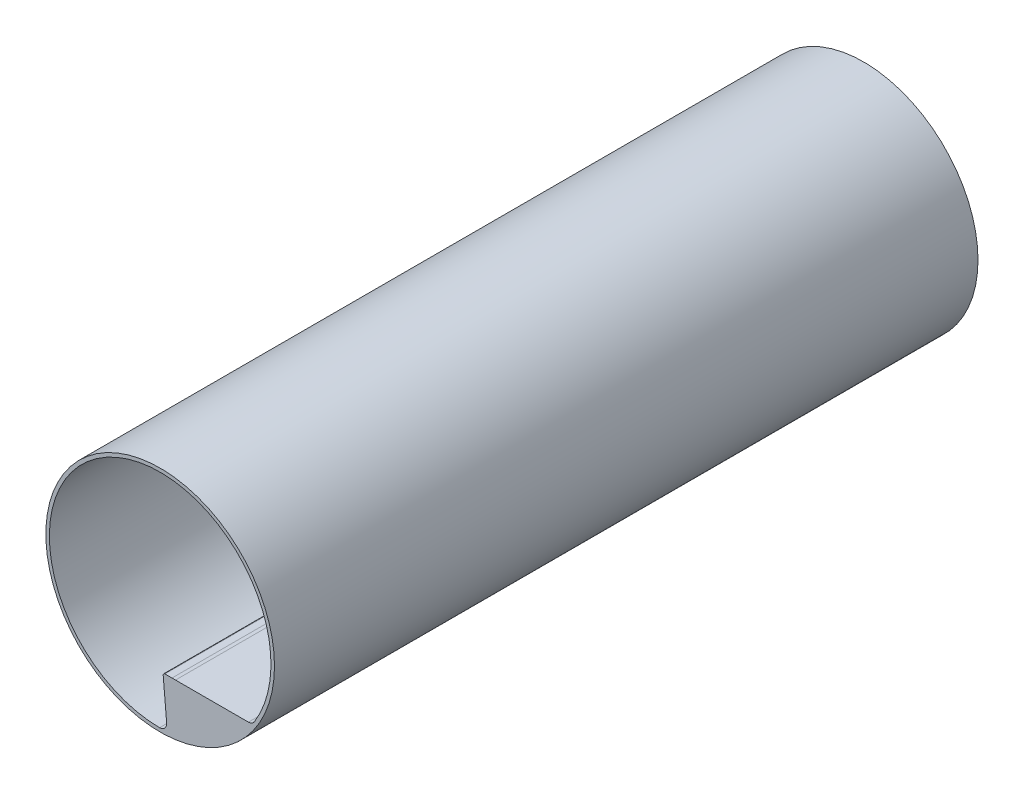
ISO-10303-21;
HEADER;
FILE_DESCRIPTION(('STEP AP214'),'2;1');
FILE_NAME('part.step','',(''),(''),'','','');
FILE_SCHEMA(('AUTOMOTIVE_DESIGN { 1 0 10303 214 1 1 1 1 }'));
ENDSEC;
DATA;
#1=APPLICATION_CONTEXT('core data for automotive mechanical design processes');
#2=APPLICATION_PROTOCOL_DEFINITION('international standard','automotive_design',2000,#1);
#3=PRODUCT_CONTEXT('',#1,'mechanical');
#4=PRODUCT('Part','Part','',(#3));
#5=PRODUCT_RELATED_PRODUCT_CATEGORY('part','',(#4));
#6=PRODUCT_DEFINITION_FORMATION('','',#4);
#7=PRODUCT_DEFINITION_CONTEXT('part definition',#1,'design');
#8=PRODUCT_DEFINITION('design','',#6,#7);
#9=PRODUCT_DEFINITION_SHAPE('','',#8);
#10=(LENGTH_UNIT() NAMED_UNIT(*) SI_UNIT(.MILLI.,.METRE.));
#11=(NAMED_UNIT(*) PLANE_ANGLE_UNIT() SI_UNIT($,.RADIAN.));
#12=(NAMED_UNIT(*) SI_UNIT($,.STERADIAN.) SOLID_ANGLE_UNIT());
#13=UNCERTAINTY_MEASURE_WITH_UNIT(LENGTH_MEASURE(1.E-05),#10,'distance_accuracy_value','');
#14=(GEOMETRIC_REPRESENTATION_CONTEXT(3) GLOBAL_UNCERTAINTY_ASSIGNED_CONTEXT((#13)) GLOBAL_UNIT_ASSIGNED_CONTEXT((#10,
#11,#12)) REPRESENTATION_CONTEXT('',''));
#15=CARTESIAN_POINT('',(0.,0.,0.));
#16=DIRECTION('',(0.,0.,1.));
#17=DIRECTION('',(1.,0.,0.));
#18=AXIS2_PLACEMENT_3D('',#15,#16,#17);
#19=CARTESIAN_POINT('',(80.8398292582413,-1750.,20000.));
#20=DIRECTION('',(0.,1.,0.));
#21=DIRECTION('',(0.,0.,1.));
#22=AXIS2_PLACEMENT_3D('',#19,#20,#21);
#23=PLANE('',#22);
#24=DIRECTION('',(1.,0.,0.));
#25=VECTOR('',#24,1.);
#26=CARTESIAN_POINT('',(80.8398292582413,-1750.,0.));
#27=LINE('',#26,#25);
#28=CARTESIAN_POINT('',(436.724186643337,-1750.,0.));
#29=VERTEX_POINT('',#28);
#30=CARTESIAN_POINT('',(2509.98007960223,-1750.,0.));
#31=VERTEX_POINT('',#30);
#32=EDGE_CURVE('E107',#29,#31,#27,.T.);
#33=ORIENTED_EDGE('',*,*,#32,.F.);
#34=DIRECTION('',(0.,0.,1.));
#35=VECTOR('',#34,1.);
#36=CARTESIAN_POINT('',(436.724186643337,-1750.,20000.));
#37=LINE('',#36,#35);
#38=CARTESIAN_POINT('',(436.724186643337,-1750.,20000.));
#39=VERTEX_POINT('',#38);
#40=EDGE_CURVE('E11',#29,#39,#37,.T.);
#41=ORIENTED_EDGE('',*,*,#40,.T.);
#42=DIRECTION('',(1.,0.,0.));
#43=VECTOR('',#42,1.);
#44=CARTESIAN_POINT('',(80.8398292582413,-1750.,20000.));
#45=LINE('',#44,#43);
#46=CARTESIAN_POINT('',(2509.98007960223,-1750.,20000.));
#47=VERTEX_POINT('',#46);
#48=EDGE_CURVE('E175',#39,#47,#45,.T.);
#49=ORIENTED_EDGE('',*,*,#48,.T.);
#50=DIRECTION('',(0.,0.,1.));
#51=VECTOR('',#50,1.);
#52=CARTESIAN_POINT('',(2509.98007960223,-1750.,0.));
#53=LINE('',#52,#51);
#54=EDGE_CURVE('E138',#47,#31,#53,.F.);
#55=ORIENTED_EDGE('',*,*,#54,.T.);
#56=EDGE_LOOP('',(#33,#41,#49,#55));
#57=FACE_BOUND('',#56,.T.);
#58=ADVANCED_FACE('F37',(#57),#23,.T.);
#59=CARTESIAN_POINT('',(135.405254311705,-1750.,20000.));
#60=VERTEX_POINT('',#59);
#61=CARTESIAN_POINT('',(336.724186643337,-1750.,20000.));
#62=VERTEX_POINT('',#61);
#63=EDGE_CURVE('E163',#60,#62,#45,.T.);
#64=ORIENTED_EDGE('',*,*,#63,.T.);
#65=DIRECTION('',(0.,0.,-1.));
#66=VECTOR('',#65,1.);
#67=CARTESIAN_POINT('',(336.724186643337,-1750.,20000.));
#68=LINE('',#67,#66);
#69=CARTESIAN_POINT('',(336.724186643337,-1750.,0.));
#70=VERTEX_POINT('',#69);
#71=EDGE_CURVE('E46',#62,#70,#68,.T.);
#72=ORIENTED_EDGE('',*,*,#71,.T.);
#73=CARTESIAN_POINT('',(135.405254311705,-1750.,0.));
#74=VERTEX_POINT('',#73);
#75=EDGE_CURVE('E160',#74,#70,#27,.T.);
#76=ORIENTED_EDGE('',*,*,#75,.F.);
#77=DIRECTION('',(0.,0.,-1.));
#78=VECTOR('',#77,1.);
#79=CARTESIAN_POINT('',(135.405254311705,-1750.,20000.));
#80=LINE('',#79,#78);
#81=EDGE_CURVE('E149',#74,#60,#80,.F.);
#82=ORIENTED_EDGE('',*,*,#81,.T.);
#83=EDGE_LOOP('',(#64,#72,#76,#82));
#84=FACE_BOUND('',#83,.T.);
#85=ADVANCED_FACE('F158',(#84),#23,.T.);
#86=CARTESIAN_POINT('',(0.,0.,20000.));
#87=DIRECTION('',(0.,0.,1.));
#88=DIRECTION('',(1.,0.,0.));
#89=AXIS2_PLACEMENT_3D('',#86,#87,#88);
#90=PLANE('',#89);
#91=CARTESIAN_POINT('',(0.,0.,20000.));
#92=DIRECTION('',(0.,0.,1.));
#93=DIRECTION('',(1.,0.,0.));
#94=AXIS2_PLACEMENT_3D('',#91,#92,#93);
#95=CIRCLE('',#94,3250.);
#96=CARTESIAN_POINT('',(3250.,0.,20000.));
#97=VERTEX_POINT('',#96);
#98=EDGE_CURVE('E128',#97,#97,#95,.T.);
#99=ORIENTED_EDGE('',*,*,#98,.T.);
#100=EDGE_LOOP('',(#99));
#101=FACE_BOUND('',#100,.T.);
#102=ORIENTED_EDGE('',*,*,#63,.F.);
#103=CARTESIAN_POINT('',(135.405254311705,-1800.,20000.));
#104=DIRECTION('',(0.,0.,1.));
#105=DIRECTION('',(1.,0.,0.));
#106=AXIS2_PLACEMENT_3D('',#103,#104,#105);
#107=CIRCLE('',#106,50.);
#108=CARTESIAN_POINT('',(85.5955194071174,-1804.35778713738,20000.));
#109=VERTEX_POINT('',#108);
#110=EDGE_CURVE('E151',#60,#109,#107,.T.);
#111=ORIENTED_EDGE('',*,*,#110,.T.);
#112=DIRECTION('',(-0.0871557427476551,0.996194698091746,0.));
#113=VECTOR('',#112,1.);
#114=CARTESIAN_POINT('',(80.8398292582413,-1750.,20000.));
#115=LINE('',#114,#113);
#116=CARTESIAN_POINT('',(184.297887317519,-2932.53101475971,20000.));
#117=VERTEX_POINT('',#116);
#118=EDGE_CURVE('E168',#117,#109,#115,.T.);
#119=ORIENTED_EDGE('',*,*,#118,.F.);
#120=CARTESIAN_POINT('',(-14.9410523008298,-2949.96216330924,20000.));
#121=DIRECTION('',(0.,0.,1.));
#122=DIRECTION('',(1.,0.,0.));
#123=AXIS2_PLACEMENT_3D('',#120,#121,#122);
#124=CIRCLE('',#123,200.);
#125=CARTESIAN_POINT('',(-15.9540049991912,-3149.95959810987,20000.));
#126=VERTEX_POINT('',#125);
#127=EDGE_CURVE('E113',#117,#126,#124,.F.);
#128=ORIENTED_EDGE('',*,*,#127,.T.);
#129=CARTESIAN_POINT('',(0.,0.,20000.));
#130=DIRECTION('',(0.,0.,1.));
#131=DIRECTION('',(1.,0.,0.));
#132=AXIS2_PLACEMENT_3D('',#129,#130,#131);
#133=CIRCLE('',#132,3150.);
#134=CARTESIAN_POINT('',(2680.14822059221,-1655.08474576271,20000.));
#135=VERTEX_POINT('',#134);
#136=EDGE_CURVE('E167',#135,#126,#133,.T.);
#137=ORIENTED_EDGE('',*,*,#136,.F.);
#138=CARTESIAN_POINT('',(2509.98007960223,-1550.,20000.));
#139=DIRECTION('',(0.,0.,1.));
#140=DIRECTION('',(1.,0.,0.));
#141=AXIS2_PLACEMENT_3D('',#138,#139,#140);
#142=CIRCLE('',#141,200.);
#143=EDGE_CURVE('E112',#135,#47,#142,.F.);
#144=ORIENTED_EDGE('',*,*,#143,.T.);
#145=ORIENTED_EDGE('',*,*,#48,.F.);
#146=EDGE_CURVE('E174',#62,#39,#45,.T.);
#147=ORIENTED_EDGE('',*,*,#146,.F.);
#148=EDGE_LOOP('',(#102,#111,#119,#128,#137,#144,#145,#147));
#149=FACE_BOUND('',#148,.T.);
#150=ADVANCED_FACE('F181',(#101,#149),#90,.T.);
#151=CARTESIAN_POINT('',(0.,0.,0.));
#152=DIRECTION('',(0.,0.,1.));
#153=DIRECTION('',(1.,0.,0.));
#154=AXIS2_PLACEMENT_3D('',#151,#152,#153);
#155=PLANE('',#154);
#156=CARTESIAN_POINT('',(0.,0.,0.));
#157=DIRECTION('',(0.,0.,1.));
#158=DIRECTION('',(1.,0.,0.));
#159=AXIS2_PLACEMENT_3D('',#156,#157,#158);
#160=CIRCLE('',#159,3250.);
#161=CARTESIAN_POINT('',(3250.,0.,0.));
#162=VERTEX_POINT('',#161);
#163=EDGE_CURVE('E133',#162,#162,#160,.T.);
#164=ORIENTED_EDGE('',*,*,#163,.F.);
#165=EDGE_LOOP('',(#164));
#166=FACE_BOUND('',#165,.T.);
#167=DIRECTION('',(-0.0871557427476551,0.996194698091746,0.));
#168=VECTOR('',#167,1.);
#169=CARTESIAN_POINT('',(80.8398292582413,-1750.,0.));
#170=LINE('',#169,#168);
#171=CARTESIAN_POINT('',(184.297887317519,-2932.53101475971,0.));
#172=VERTEX_POINT('',#171);
#173=CARTESIAN_POINT('',(85.5955194071174,-1804.35778713738,0.));
#174=VERTEX_POINT('',#173);
#175=EDGE_CURVE('E123',#172,#174,#170,.T.);
#176=ORIENTED_EDGE('',*,*,#175,.T.);
#177=CARTESIAN_POINT('',(135.405254311705,-1800.,0.));
#178=DIRECTION('',(0.,0.,1.));
#179=DIRECTION('',(1.,0.,0.));
#180=AXIS2_PLACEMENT_3D('',#177,#178,#179);
#181=CIRCLE('',#180,50.);
#182=EDGE_CURVE('E147',#174,#74,#181,.F.);
#183=ORIENTED_EDGE('',*,*,#182,.T.);
#184=ORIENTED_EDGE('',*,*,#75,.T.);
#185=EDGE_CURVE('E164',#70,#29,#27,.T.);
#186=ORIENTED_EDGE('',*,*,#185,.T.);
#187=ORIENTED_EDGE('',*,*,#32,.T.);
#188=CARTESIAN_POINT('',(2509.98007960223,-1550.,0.));
#189=DIRECTION('',(0.,0.,1.));
#190=DIRECTION('',(1.,0.,0.));
#191=AXIS2_PLACEMENT_3D('',#188,#189,#190);
#192=CIRCLE('',#191,200.);
#193=CARTESIAN_POINT('',(2680.14822059221,-1655.08474576271,0.));
#194=VERTEX_POINT('',#193);
#195=EDGE_CURVE('E101',#31,#194,#192,.T.);
#196=ORIENTED_EDGE('',*,*,#195,.T.);
#197=CARTESIAN_POINT('',(0.,0.,0.));
#198=DIRECTION('',(0.,0.,1.));
#199=DIRECTION('',(1.,0.,0.));
#200=AXIS2_PLACEMENT_3D('',#197,#198,#199);
#201=CIRCLE('',#200,3150.);
#202=CARTESIAN_POINT('',(-15.9540049991912,-3149.95959810987,0.));
#203=VERTEX_POINT('',#202);
#204=EDGE_CURVE('E105',#194,#203,#201,.T.);
#205=ORIENTED_EDGE('',*,*,#204,.T.);
#206=CARTESIAN_POINT('',(-14.9410523008298,-2949.96216330924,0.));
#207=DIRECTION('',(0.,0.,1.));
#208=DIRECTION('',(1.,0.,0.));
#209=AXIS2_PLACEMENT_3D('',#206,#207,#208);
#210=CIRCLE('',#209,200.);
#211=EDGE_CURVE('E140',#203,#172,#210,.T.);
#212=ORIENTED_EDGE('',*,*,#211,.T.);
#213=EDGE_LOOP('',(#176,#183,#184,#186,#187,#196,#205,#212));
#214=FACE_BOUND('',#213,.T.);
#215=ADVANCED_FACE('F104',(#166,#214),#155,.F.);
#216=CARTESIAN_POINT('',(0.,0.,20000.));
#217=DIRECTION('',(0.,0.,-1.));
#218=DIRECTION('',(-1.,0.,0.));
#219=AXIS2_PLACEMENT_3D('',#216,#217,#218);
#220=CYLINDRICAL_SURFACE('',#219,3250.);
#221=ORIENTED_EDGE('',*,*,#98,.F.);
#222=EDGE_LOOP('',(#221));
#223=FACE_BOUND('',#222,.T.);
#224=ORIENTED_EDGE('',*,*,#163,.T.);
#225=EDGE_LOOP('',(#224));
#226=FACE_BOUND('',#225,.T.);
#227=ADVANCED_FACE('F203',(#223,#226),#220,.T.);
#228=CARTESIAN_POINT('',(0.,0.,20000.));
#229=DIRECTION('',(0.,0.,-1.));
#230=DIRECTION('',(-1.,0.,0.));
#231=AXIS2_PLACEMENT_3D('',#228,#229,#230);
#232=CYLINDRICAL_SURFACE('',#231,3150.);
#233=ORIENTED_EDGE('',*,*,#136,.T.);
#234=DIRECTION('',(0.,0.,-1.));
#235=VECTOR('',#234,1.);
#236=CARTESIAN_POINT('',(-15.9540049991912,-3149.95959810987,20000.));
#237=LINE('',#236,#235);
#238=EDGE_CURVE('E122',#126,#203,#237,.T.);
#239=ORIENTED_EDGE('',*,*,#238,.T.);
#240=ORIENTED_EDGE('',*,*,#204,.F.);
#241=DIRECTION('',(0.,0.,-1.));
#242=VECTOR('',#241,1.);
#243=CARTESIAN_POINT('',(2680.14822059221,-1655.08474576271,20000.));
#244=LINE('',#243,#242);
#245=EDGE_CURVE('E119',#194,#135,#244,.F.);
#246=ORIENTED_EDGE('',*,*,#245,.T.);
#247=EDGE_LOOP('',(#233,#239,#240,#246));
#248=FACE_BOUND('',#247,.T.);
#249=ADVANCED_FACE('F118',(#248),#232,.F.);
#250=CARTESIAN_POINT('',(80.8398292582413,-1750.,20000.));
#251=DIRECTION('',(-0.996194698091746,-0.0871557427476551,0.));
#252=DIRECTION('',(0.0871557427476551,-0.996194698091746,0.));
#253=AXIS2_PLACEMENT_3D('',#250,#251,#252);
#254=PLANE('',#253);
#255=ORIENTED_EDGE('',*,*,#118,.T.);
#256=DIRECTION('',(0.,0.,-1.));
#257=VECTOR('',#256,1.);
#258=CARTESIAN_POINT('',(85.5955194071174,-1804.35778713738,20000.));
#259=LINE('',#258,#257);
#260=EDGE_CURVE('E144',#109,#174,#259,.T.);
#261=ORIENTED_EDGE('',*,*,#260,.T.);
#262=ORIENTED_EDGE('',*,*,#175,.F.);
#263=DIRECTION('',(0.,0.,1.));
#264=VECTOR('',#263,1.);
#265=CARTESIAN_POINT('',(184.297887317519,-2932.53101475971,20000.));
#266=LINE('',#265,#264);
#267=EDGE_CURVE('E130',#172,#117,#266,.T.);
#268=ORIENTED_EDGE('',*,*,#267,.T.);
#269=EDGE_LOOP('',(#255,#261,#262,#268));
#270=FACE_BOUND('',#269,.T.);
#271=ADVANCED_FACE('F192',(#270),#254,.T.);
#272=ORIENTED_EDGE('',*,*,#40,.F.);
#273=ORIENTED_EDGE('',*,*,#185,.F.);
#274=ORIENTED_EDGE('',*,*,#71,.F.);
#275=ORIENTED_EDGE('',*,*,#146,.T.);
#276=EDGE_LOOP('',(#272,#273,#274,#275));
#277=FACE_BOUND('',#276,.T.);
#278=ADVANCED_FACE('F165',(#277),#23,.T.);
#279=CARTESIAN_POINT('',(-14.9410523008298,-2949.96216330924,20000.));
#280=DIRECTION('',(0.,0.,-1.));
#281=DIRECTION('',(-1.,0.,0.));
#282=AXIS2_PLACEMENT_3D('',#279,#280,#281);
#283=CYLINDRICAL_SURFACE('',#282,200.);
#284=ORIENTED_EDGE('',*,*,#127,.F.);
#285=ORIENTED_EDGE('',*,*,#267,.F.);
#286=ORIENTED_EDGE('',*,*,#211,.F.);
#287=ORIENTED_EDGE('',*,*,#238,.F.);
#288=EDGE_LOOP('',(#284,#285,#286,#287));
#289=FACE_BOUND('',#288,.T.);
#290=ADVANCED_FACE('F191',(#289),#283,.F.);
#291=CARTESIAN_POINT('',(2509.98007960223,-1550.,20000.));
#292=DIRECTION('',(0.,0.,-1.));
#293=DIRECTION('',(-1.,0.,0.));
#294=AXIS2_PLACEMENT_3D('',#291,#292,#293);
#295=CYLINDRICAL_SURFACE('',#294,200.);
#296=ORIENTED_EDGE('',*,*,#143,.F.);
#297=ORIENTED_EDGE('',*,*,#245,.F.);
#298=ORIENTED_EDGE('',*,*,#195,.F.);
#299=ORIENTED_EDGE('',*,*,#54,.F.);
#300=EDGE_LOOP('',(#296,#297,#298,#299));
#301=FACE_BOUND('',#300,.T.);
#302=ADVANCED_FACE('F126',(#301),#295,.F.);
#303=CARTESIAN_POINT('',(135.405254311705,-1800.,20000.));
#304=DIRECTION('',(0.,0.,-1.));
#305=DIRECTION('',(-1.,0.,0.));
#306=AXIS2_PLACEMENT_3D('',#303,#304,#305);
#307=CYLINDRICAL_SURFACE('',#306,50.);
#308=ORIENTED_EDGE('',*,*,#110,.F.);
#309=ORIENTED_EDGE('',*,*,#81,.F.);
#310=ORIENTED_EDGE('',*,*,#182,.F.);
#311=ORIENTED_EDGE('',*,*,#260,.F.);
#312=EDGE_LOOP('',(#308,#309,#310,#311));
#313=FACE_BOUND('',#312,.T.);
#314=ADVANCED_FACE('F39',(#313),#307,.T.);
#315=CLOSED_SHELL('',(#58,#85,#150,#215,#227,#249,#271,#278,#290,#302,#314));
#316=MANIFOLD_SOLID_BREP('B2',#315);
#317=ADVANCED_BREP_SHAPE_REPRESENTATION('',(#18,#316),#14);
#318=SHAPE_DEFINITION_REPRESENTATION(#9,#317);
ENDSEC;
END-ISO-10303-21;
